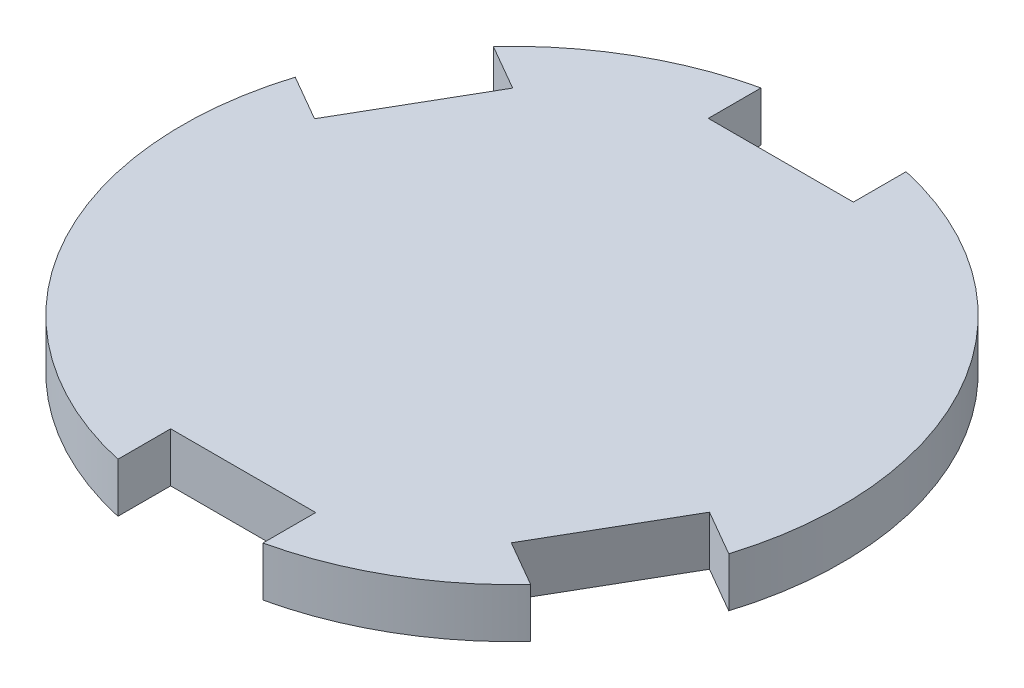
ISO-10303-21;
HEADER;
FILE_DESCRIPTION(('STEP AP214'),'2;1');
FILE_NAME('part.step','',(''),(''),'','','');
FILE_SCHEMA(('AUTOMOTIVE_DESIGN { 1 0 10303 214 1 1 1 1 }'));
ENDSEC;
DATA;
#1=APPLICATION_CONTEXT('core data for automotive mechanical design processes');
#2=APPLICATION_PROTOCOL_DEFINITION('international standard','automotive_design',2000,#1);
#3=PRODUCT_CONTEXT('',#1,'mechanical');
#4=PRODUCT('Part','Part','',(#3));
#5=PRODUCT_RELATED_PRODUCT_CATEGORY('part','',(#4));
#6=PRODUCT_DEFINITION_FORMATION('','',#4);
#7=PRODUCT_DEFINITION_CONTEXT('part definition',#1,'design');
#8=PRODUCT_DEFINITION('design','',#6,#7);
#9=PRODUCT_DEFINITION_SHAPE('','',#8);
#10=(LENGTH_UNIT() NAMED_UNIT(*) SI_UNIT(.MILLI.,.METRE.));
#11=(NAMED_UNIT(*) PLANE_ANGLE_UNIT() SI_UNIT($,.RADIAN.));
#12=(NAMED_UNIT(*) SI_UNIT($,.STERADIAN.) SOLID_ANGLE_UNIT());
#13=UNCERTAINTY_MEASURE_WITH_UNIT(LENGTH_MEASURE(1.E-05),#10,'distance_accuracy_value','');
#14=(GEOMETRIC_REPRESENTATION_CONTEXT(3) GLOBAL_UNCERTAINTY_ASSIGNED_CONTEXT((#13)) GLOBAL_UNIT_ASSIGNED_CONTEXT((#10,
#11,#12)) REPRESENTATION_CONTEXT('',''));
#15=CARTESIAN_POINT('',(0.,0.,0.));
#16=DIRECTION('',(0.,0.,1.));
#17=DIRECTION('',(1.,0.,0.));
#18=AXIS2_PLACEMENT_3D('',#15,#16,#17);
#19=CARTESIAN_POINT('',(0.,4.7625,0.));
#20=DIRECTION('',(0.,-1.,0.));
#21=DIRECTION('',(0.,0.,-1.));
#22=AXIS2_PLACEMENT_3D('',#19,#20,#21);
#23=CYLINDRICAL_SURFACE('',#22,31.75);
#24=DIRECTION('',(0.,1.,0.));
#25=VECTOR('',#24,1.);
#26=CARTESIAN_POINT('',(30.3151435358262,-0.00100000000000013,9.43687302035226));
#27=LINE('',#26,#25);
#28=CARTESIAN_POINT('',(30.3151435358262,0.,9.43687302035226));
#29=VERTEX_POINT('',#28);
#30=CARTESIAN_POINT('',(30.3151435358262,4.7625,9.43687302035226));
#31=VERTEX_POINT('',#30);
#32=EDGE_CURVE('E158',#29,#31,#27,.T.);
#33=ORIENTED_EDGE('',*,*,#32,.F.);
#34=CARTESIAN_POINT('',(0.,0.,0.));
#35=DIRECTION('',(0.,1.,0.));
#36=DIRECTION('',(0.,0.,1.));
#37=AXIS2_PLACEMENT_3D('',#34,#35,#36);
#38=CIRCLE('',#37,31.75);
#39=CARTESIAN_POINT('',(6.98500000000001,0.,-30.9721209315733));
#40=VERTEX_POINT('',#39);
#41=EDGE_CURVE('E171',#29,#40,#38,.T.);
#42=ORIENTED_EDGE('',*,*,#41,.T.);
#43=DIRECTION('',(0.,1.,0.));
#44=VECTOR('',#43,1.);
#45=CARTESIAN_POINT('',(6.98500000000001,-0.00100000000000013,-30.9721209315733));
#46=LINE('',#45,#44);
#47=CARTESIAN_POINT('',(6.98500000000001,4.7625,-30.9721209315733));
#48=VERTEX_POINT('',#47);
#49=EDGE_CURVE('E213',#40,#48,#46,.T.);
#50=ORIENTED_EDGE('',*,*,#49,.T.);
#51=CARTESIAN_POINT('',(0.,4.7625,0.));
#52=DIRECTION('',(0.,1.,0.));
#53=DIRECTION('',(0.,0.,1.));
#54=AXIS2_PLACEMENT_3D('',#51,#52,#53);
#55=CIRCLE('',#54,31.75);
#56=EDGE_CURVE('E43',#31,#48,#55,.T.);
#57=ORIENTED_EDGE('',*,*,#56,.F.);
#58=EDGE_LOOP('',(#33,#42,#50,#57));
#59=FACE_BOUND('',#58,.T.);
#60=ADVANCED_FACE('F34',(#59),#23,.T.);
#61=DIRECTION('',(0.,1.,0.));
#62=VECTOR('',#61,1.);
#63=CARTESIAN_POINT('',(-30.3151435358262,-0.00100000000000013,-9.43687302035226));
#64=LINE('',#63,#62);
#65=CARTESIAN_POINT('',(-30.3151435358262,0.,-9.43687302035226));
#66=VERTEX_POINT('',#65);
#67=CARTESIAN_POINT('',(-30.3151435358262,4.7625,-9.43687302035226));
#68=VERTEX_POINT('',#67);
#69=EDGE_CURVE('E263',#66,#68,#64,.T.);
#70=ORIENTED_EDGE('',*,*,#69,.F.);
#71=CARTESIAN_POINT('',(-6.985,0.,30.9721209315733));
#72=VERTEX_POINT('',#71);
#73=EDGE_CURVE('E172',#66,#72,#38,.T.);
#74=ORIENTED_EDGE('',*,*,#73,.T.);
#75=DIRECTION('',(0.,1.,0.));
#76=VECTOR('',#75,1.);
#77=CARTESIAN_POINT('',(-6.985,-0.00100000000000013,30.9721209315733));
#78=LINE('',#77,#76);
#79=CARTESIAN_POINT('',(-6.985,4.7625,30.9721209315733));
#80=VERTEX_POINT('',#79);
#81=EDGE_CURVE('E237',#72,#80,#78,.T.);
#82=ORIENTED_EDGE('',*,*,#81,.T.);
#83=EDGE_CURVE('E170',#68,#80,#55,.T.);
#84=ORIENTED_EDGE('',*,*,#83,.F.);
#85=EDGE_LOOP('',(#70,#74,#82,#84));
#86=FACE_BOUND('',#85,.T.);
#87=ADVANCED_FACE('F262',(#86),#23,.T.);
#88=CARTESIAN_POINT('',(0.,4.7625,0.));
#89=DIRECTION('',(0.,1.,0.));
#90=DIRECTION('',(0.,0.,1.));
#91=AXIS2_PLACEMENT_3D('',#88,#89,#90);
#92=PLANE('',#91);
#93=DIRECTION('',(0.86602540378444,0.,0.499999999999998));
#94=VECTOR('',#93,1.);
#95=CARTESIAN_POINT('',(18.9307344846013,4.7625,18.9952479112209));
#96=LINE('',#95,#94);
#97=CARTESIAN_POINT('',(18.9307344846013,4.7625,18.9952479112209));
#98=VERTEX_POINT('',#97);
#99=CARTESIAN_POINT('',(23.3301435358263,4.7625,21.5352479112209));
#100=VERTEX_POINT('',#99);
#101=EDGE_CURVE('E154',#98,#100,#96,.T.);
#102=ORIENTED_EDGE('',*,*,#101,.F.);
#103=DIRECTION('',(0.499999999999995,0.,-0.866025403784441));
#104=VECTOR('',#103,1.);
#105=CARTESIAN_POINT('',(18.9307344846013,4.7625,18.9952479112209));
#106=LINE('',#105,#104);
#107=CARTESIAN_POINT('',(25.9157344846013,4.7625,6.89687302035227));
#108=VERTEX_POINT('',#107);
#109=EDGE_CURVE('E159',#98,#108,#106,.T.);
#110=ORIENTED_EDGE('',*,*,#109,.T.);
#111=DIRECTION('',(0.86602540378444,0.,0.499999999999998));
#112=VECTOR('',#111,1.);
#113=CARTESIAN_POINT('',(25.9157344846013,4.7625,6.89687302035227));
#114=LINE('',#113,#112);
#115=EDGE_CURVE('E346',#108,#31,#114,.T.);
#116=ORIENTED_EDGE('',*,*,#115,.T.);
#117=ORIENTED_EDGE('',*,*,#56,.T.);
#118=DIRECTION('',(0.,0.,-1.));
#119=VECTOR('',#118,1.);
#120=CARTESIAN_POINT('',(6.985,4.7625,-25.8921209315733));
#121=LINE('',#120,#119);
#122=CARTESIAN_POINT('',(6.985,4.7625,-25.8921209315733));
#123=VERTEX_POINT('',#122);
#124=EDGE_CURVE('E210',#123,#48,#121,.T.);
#125=ORIENTED_EDGE('',*,*,#124,.F.);
#126=DIRECTION('',(1.,0.,0.));
#127=VECTOR('',#126,1.);
#128=CARTESIAN_POINT('',(-6.98500000000001,4.7625,-25.8921209315733));
#129=LINE('',#128,#127);
#130=CARTESIAN_POINT('',(-6.98500000000001,4.7625,-25.8921209315733));
#131=VERTEX_POINT('',#130);
#132=EDGE_CURVE('E207',#131,#123,#129,.T.);
#133=ORIENTED_EDGE('',*,*,#132,.F.);
#134=DIRECTION('',(0.,0.,1.));
#135=VECTOR('',#134,1.);
#136=CARTESIAN_POINT('',(-6.98500000000001,4.7625,-30.9721209315733));
#137=LINE('',#136,#135);
#138=CARTESIAN_POINT('',(-6.98500000000001,4.7625,-30.9721209315733));
#139=VERTEX_POINT('',#138);
#140=EDGE_CURVE('E204',#139,#131,#137,.T.);
#141=ORIENTED_EDGE('',*,*,#140,.F.);
#142=CARTESIAN_POINT('',(-23.3301435358263,4.7625,-21.5352479112209));
#143=VERTEX_POINT('',#142);
#144=EDGE_CURVE('E44',#139,#143,#55,.T.);
#145=ORIENTED_EDGE('',*,*,#144,.T.);
#146=DIRECTION('',(-0.86602540378444,0.,-0.499999999999997));
#147=VECTOR('',#146,1.);
#148=CARTESIAN_POINT('',(-18.9307344846013,4.7625,-18.9952479112209));
#149=LINE('',#148,#147);
#150=CARTESIAN_POINT('',(-18.9307344846013,4.7625,-18.9952479112209));
#151=VERTEX_POINT('',#150);
#152=EDGE_CURVE('E283',#151,#143,#149,.T.);
#153=ORIENTED_EDGE('',*,*,#152,.F.);
#154=DIRECTION('',(0.499999999999998,0.,-0.86602540378444));
#155=VECTOR('',#154,1.);
#156=CARTESIAN_POINT('',(-25.9157344846013,4.7625,-6.89687302035227));
#157=LINE('',#156,#155);
#158=CARTESIAN_POINT('',(-25.9157344846013,4.7625,-6.89687302035227));
#159=VERTEX_POINT('',#158);
#160=EDGE_CURVE('E272',#159,#151,#157,.T.);
#161=ORIENTED_EDGE('',*,*,#160,.F.);
#162=DIRECTION('',(-0.86602540378444,0.,-0.499999999999998));
#163=VECTOR('',#162,1.);
#164=CARTESIAN_POINT('',(-25.9157344846013,4.7625,-6.89687302035227));
#165=LINE('',#164,#163);
#166=EDGE_CURVE('E194',#159,#68,#165,.T.);
#167=ORIENTED_EDGE('',*,*,#166,.T.);
#168=ORIENTED_EDGE('',*,*,#83,.T.);
#169=DIRECTION('',(0.,0.,1.));
#170=VECTOR('',#169,1.);
#171=CARTESIAN_POINT('',(-6.985,4.7625,30.9721209315733));
#172=LINE('',#171,#170);
#173=CARTESIAN_POINT('',(-6.985,4.7625,25.8921209315733));
#174=VERTEX_POINT('',#173);
#175=EDGE_CURVE('E234',#174,#80,#172,.T.);
#176=ORIENTED_EDGE('',*,*,#175,.F.);
#177=DIRECTION('',(-1.,0.,0.));
#178=VECTOR('',#177,1.);
#179=CARTESIAN_POINT('',(-6.985,4.7625,25.8921209315733));
#180=LINE('',#179,#178);
#181=CARTESIAN_POINT('',(6.985,4.7625,25.8921209315733));
#182=VERTEX_POINT('',#181);
#183=EDGE_CURVE('E231',#182,#174,#180,.T.);
#184=ORIENTED_EDGE('',*,*,#183,.F.);
#185=DIRECTION('',(0.,0.,-1.));
#186=VECTOR('',#185,1.);
#187=CARTESIAN_POINT('',(6.985,4.7625,25.8921209315733));
#188=LINE('',#187,#186);
#189=CARTESIAN_POINT('',(6.98500000000001,4.7625,30.9721209315733));
#190=VERTEX_POINT('',#189);
#191=EDGE_CURVE('E228',#190,#182,#188,.T.);
#192=ORIENTED_EDGE('',*,*,#191,.F.);
#193=EDGE_CURVE('E11',#190,#100,#55,.T.);
#194=ORIENTED_EDGE('',*,*,#193,.T.);
#195=EDGE_LOOP('',(#102,#110,#116,#117,#125,#133,#141,#145,#153,#161,#167,#168,#176,#184,#192,#194));
#196=FACE_BOUND('',#195,.T.);
#197=ADVANCED_FACE('F285',(#196),#92,.T.);
#198=CARTESIAN_POINT('',(0.,0.,0.));
#199=DIRECTION('',(0.,1.,0.));
#200=DIRECTION('',(0.,0.,1.));
#201=AXIS2_PLACEMENT_3D('',#198,#199,#200);
#202=PLANE('',#201);
#203=DIRECTION('',(-0.499999999999995,0.,0.866025403784441));
#204=VECTOR('',#203,1.);
#205=CARTESIAN_POINT('',(18.9307344846013,0.,18.9952479112209));
#206=LINE('',#205,#204);
#207=CARTESIAN_POINT('',(25.9157344846013,0.,6.89687302035227));
#208=VERTEX_POINT('',#207);
#209=CARTESIAN_POINT('',(18.9307344846013,0.,18.9952479112209));
#210=VERTEX_POINT('',#209);
#211=EDGE_CURVE('E51',#208,#210,#206,.T.);
#212=ORIENTED_EDGE('',*,*,#211,.T.);
#213=DIRECTION('',(-0.86602540378444,0.,-0.499999999999998));
#214=VECTOR('',#213,1.);
#215=CARTESIAN_POINT('',(18.9307344846013,0.,18.9952479112209));
#216=LINE('',#215,#214);
#217=CARTESIAN_POINT('',(23.3301435358263,0.,21.5352479112209));
#218=VERTEX_POINT('',#217);
#219=EDGE_CURVE('E152',#218,#210,#216,.T.);
#220=ORIENTED_EDGE('',*,*,#219,.F.);
#221=CARTESIAN_POINT('',(6.98500000000001,0.,30.9721209315733));
#222=VERTEX_POINT('',#221);
#223=EDGE_CURVE('E38',#222,#218,#38,.T.);
#224=ORIENTED_EDGE('',*,*,#223,.F.);
#225=DIRECTION('',(0.,0.,1.));
#226=VECTOR('',#225,1.);
#227=CARTESIAN_POINT('',(6.985,0.,25.8921209315733));
#228=LINE('',#227,#226);
#229=CARTESIAN_POINT('',(6.985,0.,25.8921209315733));
#230=VERTEX_POINT('',#229);
#231=EDGE_CURVE('E201',#230,#222,#228,.T.);
#232=ORIENTED_EDGE('',*,*,#231,.F.);
#233=DIRECTION('',(1.,0.,0.));
#234=VECTOR('',#233,1.);
#235=CARTESIAN_POINT('',(-6.985,0.,25.8921209315733));
#236=LINE('',#235,#234);
#237=CARTESIAN_POINT('',(-6.985,0.,25.8921209315733));
#238=VERTEX_POINT('',#237);
#239=EDGE_CURVE('E222',#238,#230,#236,.T.);
#240=ORIENTED_EDGE('',*,*,#239,.F.);
#241=DIRECTION('',(0.,0.,-1.));
#242=VECTOR('',#241,1.);
#243=CARTESIAN_POINT('',(-6.985,0.,30.9721209315733));
#244=LINE('',#243,#242);
#245=EDGE_CURVE('E224',#72,#238,#244,.T.);
#246=ORIENTED_EDGE('',*,*,#245,.F.);
#247=ORIENTED_EDGE('',*,*,#73,.F.);
#248=DIRECTION('',(0.86602540378444,0.,0.499999999999998));
#249=VECTOR('',#248,1.);
#250=CARTESIAN_POINT('',(-25.9157344846013,0.,-6.89687302035227));
#251=LINE('',#250,#249);
#252=CARTESIAN_POINT('',(-25.9157344846013,0.,-6.89687302035227));
#253=VERTEX_POINT('',#252);
#254=EDGE_CURVE('E191',#66,#253,#251,.T.);
#255=ORIENTED_EDGE('',*,*,#254,.T.);
#256=DIRECTION('',(-0.499999999999998,0.,0.86602540378444));
#257=VECTOR('',#256,1.);
#258=CARTESIAN_POINT('',(-25.9157344846013,0.,-6.89687302035227));
#259=LINE('',#258,#257);
#260=CARTESIAN_POINT('',(-18.9307344846013,0.,-18.9952479112209));
#261=VERTEX_POINT('',#260);
#262=EDGE_CURVE('E189',#261,#253,#259,.T.);
#263=ORIENTED_EDGE('',*,*,#262,.F.);
#264=DIRECTION('',(0.86602540378444,0.,0.499999999999997));
#265=VECTOR('',#264,1.);
#266=CARTESIAN_POINT('',(-18.9307344846013,0.,-18.9952479112209));
#267=LINE('',#266,#265);
#268=CARTESIAN_POINT('',(-23.3301435358263,0.,-21.5352479112209));
#269=VERTEX_POINT('',#268);
#270=EDGE_CURVE('E59',#269,#261,#267,.T.);
#271=ORIENTED_EDGE('',*,*,#270,.F.);
#272=CARTESIAN_POINT('',(-6.98500000000001,0.,-30.9721209315733));
#273=VERTEX_POINT('',#272);
#274=EDGE_CURVE('E173',#273,#269,#38,.T.);
#275=ORIENTED_EDGE('',*,*,#274,.F.);
#276=DIRECTION('',(0.,0.,-1.));
#277=VECTOR('',#276,1.);
#278=CARTESIAN_POINT('',(-6.98500000000001,0.,-30.9721209315733));
#279=LINE('',#278,#277);
#280=CARTESIAN_POINT('',(-6.98500000000001,0.,-25.8921209315733));
#281=VERTEX_POINT('',#280);
#282=EDGE_CURVE('E174',#281,#273,#279,.T.);
#283=ORIENTED_EDGE('',*,*,#282,.F.);
#284=DIRECTION('',(-1.,0.,0.));
#285=VECTOR('',#284,1.);
#286=CARTESIAN_POINT('',(-6.98500000000001,0.,-25.8921209315733));
#287=LINE('',#286,#285);
#288=CARTESIAN_POINT('',(6.985,0.,-25.8921209315733));
#289=VERTEX_POINT('',#288);
#290=EDGE_CURVE('E198',#289,#281,#287,.T.);
#291=ORIENTED_EDGE('',*,*,#290,.F.);
#292=DIRECTION('',(0.,0.,1.));
#293=VECTOR('',#292,1.);
#294=CARTESIAN_POINT('',(6.985,0.,-25.8921209315733));
#295=LINE('',#294,#293);
#296=EDGE_CURVE('E200',#40,#289,#295,.T.);
#297=ORIENTED_EDGE('',*,*,#296,.F.);
#298=ORIENTED_EDGE('',*,*,#41,.F.);
#299=DIRECTION('',(-0.86602540378444,0.,-0.499999999999998));
#300=VECTOR('',#299,1.);
#301=CARTESIAN_POINT('',(25.9157344846013,0.,6.89687302035227));
#302=LINE('',#301,#300);
#303=EDGE_CURVE('E190',#29,#208,#302,.T.);
#304=ORIENTED_EDGE('',*,*,#303,.T.);
#305=EDGE_LOOP('',(#212,#220,#224,#232,#240,#246,#247,#255,#263,#271,#275,#283,#291,#297,#298,#304));
#306=FACE_BOUND('',#305,.T.);
#307=ADVANCED_FACE('F163',(#306),#202,.F.);
#308=ORIENTED_EDGE('',*,*,#223,.T.);
#309=DIRECTION('',(0.,1.,0.));
#310=VECTOR('',#309,1.);
#311=CARTESIAN_POINT('',(23.3301435358263,-0.00100000000000013,21.5352479112209));
#312=LINE('',#311,#310);
#313=EDGE_CURVE('E149',#218,#100,#312,.T.);
#314=ORIENTED_EDGE('',*,*,#313,.T.);
#315=ORIENTED_EDGE('',*,*,#193,.F.);
#316=DIRECTION('',(0.,1.,0.));
#317=VECTOR('',#316,1.);
#318=CARTESIAN_POINT('',(6.98500000000001,-0.00100000000000013,30.9721209315733));
#319=LINE('',#318,#317);
#320=EDGE_CURVE('E169',#222,#190,#319,.T.);
#321=ORIENTED_EDGE('',*,*,#320,.F.);
#322=EDGE_LOOP('',(#308,#314,#315,#321));
#323=FACE_BOUND('',#322,.T.);
#324=ADVANCED_FACE('F168',(#323),#23,.T.);
#325=ORIENTED_EDGE('',*,*,#274,.T.);
#326=DIRECTION('',(0.,1.,0.));
#327=VECTOR('',#326,1.);
#328=CARTESIAN_POINT('',(-23.3301435358263,-0.00100000000000013,-21.5352479112209));
#329=LINE('',#328,#327);
#330=EDGE_CURVE('E181',#269,#143,#329,.T.);
#331=ORIENTED_EDGE('',*,*,#330,.T.);
#332=ORIENTED_EDGE('',*,*,#144,.F.);
#333=DIRECTION('',(0.,1.,0.));
#334=VECTOR('',#333,1.);
#335=CARTESIAN_POINT('',(-6.98500000000001,-0.00100000000000013,-30.9721209315733));
#336=LINE('',#335,#334);
#337=EDGE_CURVE('E183',#273,#139,#336,.T.);
#338=ORIENTED_EDGE('',*,*,#337,.F.);
#339=EDGE_LOOP('',(#325,#331,#332,#338));
#340=FACE_BOUND('',#339,.T.);
#341=ADVANCED_FACE('F36',(#340),#23,.T.);
#342=CARTESIAN_POINT('',(-6.985,-0.00100000000000013,30.9721209315733));
#343=DIRECTION('',(-1.,0.,0.));
#344=DIRECTION('',(0.,0.,1.));
#345=AXIS2_PLACEMENT_3D('',#342,#343,#344);
#346=PLANE('',#345);
#347=ORIENTED_EDGE('',*,*,#245,.T.);
#348=DIRECTION('',(0.,1.,0.));
#349=VECTOR('',#348,1.);
#350=CARTESIAN_POINT('',(-6.985,-0.00100000000000013,25.8921209315733));
#351=LINE('',#350,#349);
#352=EDGE_CURVE('E240',#238,#174,#351,.T.);
#353=ORIENTED_EDGE('',*,*,#352,.T.);
#354=ORIENTED_EDGE('',*,*,#175,.T.);
#355=ORIENTED_EDGE('',*,*,#81,.F.);
#356=EDGE_LOOP('',(#347,#353,#354,#355));
#357=FACE_BOUND('',#356,.T.);
#358=ADVANCED_FACE('F258',(#357),#346,.F.);
#359=CARTESIAN_POINT('',(-6.985,-0.00100000000000013,25.8921209315733));
#360=DIRECTION('',(0.,0.,-1.));
#361=DIRECTION('',(-1.,0.,0.));
#362=AXIS2_PLACEMENT_3D('',#359,#360,#361);
#363=PLANE('',#362);
#364=ORIENTED_EDGE('',*,*,#239,.T.);
#365=DIRECTION('',(0.,1.,0.));
#366=VECTOR('',#365,1.);
#367=CARTESIAN_POINT('',(6.985,-0.00100000000000013,25.8921209315733));
#368=LINE('',#367,#366);
#369=EDGE_CURVE('E242',#230,#182,#368,.T.);
#370=ORIENTED_EDGE('',*,*,#369,.T.);
#371=ORIENTED_EDGE('',*,*,#183,.T.);
#372=ORIENTED_EDGE('',*,*,#352,.F.);
#373=EDGE_LOOP('',(#364,#370,#371,#372));
#374=FACE_BOUND('',#373,.T.);
#375=ADVANCED_FACE('F253',(#374),#363,.F.);
#376=CARTESIAN_POINT('',(6.985,-0.00100000000000013,25.8921209315733));
#377=DIRECTION('',(1.,0.,0.));
#378=DIRECTION('',(0.,0.,-1.));
#379=AXIS2_PLACEMENT_3D('',#376,#377,#378);
#380=PLANE('',#379);
#381=ORIENTED_EDGE('',*,*,#231,.T.);
#382=ORIENTED_EDGE('',*,*,#320,.T.);
#383=ORIENTED_EDGE('',*,*,#191,.T.);
#384=ORIENTED_EDGE('',*,*,#369,.F.);
#385=EDGE_LOOP('',(#381,#382,#383,#384));
#386=FACE_BOUND('',#385,.T.);
#387=ADVANCED_FACE('F247',(#386),#380,.F.);
#388=CARTESIAN_POINT('',(6.985,-0.00100000000000013,-25.8921209315733));
#389=DIRECTION('',(1.,0.,0.));
#390=DIRECTION('',(0.,0.,-1.));
#391=AXIS2_PLACEMENT_3D('',#388,#389,#390);
#392=PLANE('',#391);
#393=ORIENTED_EDGE('',*,*,#296,.T.);
#394=DIRECTION('',(0.,1.,0.));
#395=VECTOR('',#394,1.);
#396=CARTESIAN_POINT('',(6.985,-0.00100000000000013,-25.8921209315733));
#397=LINE('',#396,#395);
#398=EDGE_CURVE('E216',#289,#123,#397,.T.);
#399=ORIENTED_EDGE('',*,*,#398,.T.);
#400=ORIENTED_EDGE('',*,*,#124,.T.);
#401=ORIENTED_EDGE('',*,*,#49,.F.);
#402=EDGE_LOOP('',(#393,#399,#400,#401));
#403=FACE_BOUND('',#402,.T.);
#404=ADVANCED_FACE('F320',(#403),#392,.F.);
#405=CARTESIAN_POINT('',(-6.98500000000001,-0.00100000000000013,-25.8921209315733));
#406=DIRECTION('',(0.,0.,1.));
#407=DIRECTION('',(1.,0.,0.));
#408=AXIS2_PLACEMENT_3D('',#405,#406,#407);
#409=PLANE('',#408);
#410=ORIENTED_EDGE('',*,*,#290,.T.);
#411=DIRECTION('',(0.,1.,0.));
#412=VECTOR('',#411,1.);
#413=CARTESIAN_POINT('',(-6.98500000000001,-0.00100000000000013,-25.8921209315733));
#414=LINE('',#413,#412);
#415=EDGE_CURVE('E218',#281,#131,#414,.T.);
#416=ORIENTED_EDGE('',*,*,#415,.T.);
#417=ORIENTED_EDGE('',*,*,#132,.T.);
#418=ORIENTED_EDGE('',*,*,#398,.F.);
#419=EDGE_LOOP('',(#410,#416,#417,#418));
#420=FACE_BOUND('',#419,.T.);
#421=ADVANCED_FACE('F325',(#420),#409,.F.);
#422=CARTESIAN_POINT('',(-6.98500000000001,-0.00100000000000013,-30.9721209315733));
#423=DIRECTION('',(-1.,0.,0.));
#424=DIRECTION('',(0.,0.,1.));
#425=AXIS2_PLACEMENT_3D('',#422,#423,#424);
#426=PLANE('',#425);
#427=ORIENTED_EDGE('',*,*,#282,.T.);
#428=ORIENTED_EDGE('',*,*,#337,.T.);
#429=ORIENTED_EDGE('',*,*,#140,.T.);
#430=ORIENTED_EDGE('',*,*,#415,.F.);
#431=EDGE_LOOP('',(#427,#428,#429,#430));
#432=FACE_BOUND('',#431,.T.);
#433=ADVANCED_FACE('F296',(#432),#426,.F.);
#434=CARTESIAN_POINT('',(-25.9157344846013,-0.00100000000000013,-6.89687302035227));
#435=DIRECTION('',(0.499999999999998,0.,-0.86602540378444));
#436=DIRECTION('',(-0.86602540378444,0.,-0.499999999999998));
#437=AXIS2_PLACEMENT_3D('',#434,#435,#436);
#438=PLANE('',#437);
#439=ORIENTED_EDGE('',*,*,#69,.T.);
#440=ORIENTED_EDGE('',*,*,#166,.F.);
#441=DIRECTION('',(0.,1.,0.));
#442=VECTOR('',#441,1.);
#443=CARTESIAN_POINT('',(-25.9157344846013,-0.00100000000000013,-6.89687302035227));
#444=LINE('',#443,#442);
#445=EDGE_CURVE('E268',#253,#159,#444,.T.);
#446=ORIENTED_EDGE('',*,*,#445,.F.);
#447=ORIENTED_EDGE('',*,*,#254,.F.);
#448=EDGE_LOOP('',(#439,#440,#446,#447));
#449=FACE_BOUND('',#448,.T.);
#450=ADVANCED_FACE('F265',(#449),#438,.T.);
#451=CARTESIAN_POINT('',(-18.9307344846013,-0.00100000000000013,-18.9952479112209));
#452=DIRECTION('',(0.499999999999997,0.,-0.86602540378444));
#453=DIRECTION('',(-0.86602540378444,0.,-0.499999999999997));
#454=AXIS2_PLACEMENT_3D('',#451,#452,#453);
#455=PLANE('',#454);
#456=ORIENTED_EDGE('',*,*,#270,.T.);
#457=DIRECTION('',(0.,1.,0.));
#458=VECTOR('',#457,1.);
#459=CARTESIAN_POINT('',(-18.9307344846013,-0.00100000000000013,-18.9952479112209));
#460=LINE('',#459,#458);
#461=EDGE_CURVE('E273',#261,#151,#460,.T.);
#462=ORIENTED_EDGE('',*,*,#461,.T.);
#463=ORIENTED_EDGE('',*,*,#152,.T.);
#464=ORIENTED_EDGE('',*,*,#330,.F.);
#465=EDGE_LOOP('',(#456,#462,#463,#464));
#466=FACE_BOUND('',#465,.T.);
#467=ADVANCED_FACE('F288',(#466),#455,.F.);
#468=CARTESIAN_POINT('',(-25.9157344846013,-0.00100000000000013,-6.89687302035227));
#469=DIRECTION('',(0.86602540378444,0.,0.499999999999998));
#470=DIRECTION('',(0.499999999999998,0.,-0.86602540378444));
#471=AXIS2_PLACEMENT_3D('',#468,#469,#470);
#472=PLANE('',#471);
#473=ORIENTED_EDGE('',*,*,#262,.T.);
#474=ORIENTED_EDGE('',*,*,#445,.T.);
#475=ORIENTED_EDGE('',*,*,#160,.T.);
#476=ORIENTED_EDGE('',*,*,#461,.F.);
#477=EDGE_LOOP('',(#473,#474,#475,#476));
#478=FACE_BOUND('',#477,.T.);
#479=ADVANCED_FACE('F275',(#478),#472,.F.);
#480=CARTESIAN_POINT('',(18.9307344846013,-0.00100000000000013,18.9952479112209));
#481=DIRECTION('',(-0.499999999999998,0.,0.86602540378444));
#482=DIRECTION('',(0.86602540378444,0.,0.499999999999998));
#483=AXIS2_PLACEMENT_3D('',#480,#481,#482);
#484=PLANE('',#483);
#485=ORIENTED_EDGE('',*,*,#219,.T.);
#486=DIRECTION('',(0.,1.,0.));
#487=VECTOR('',#486,1.);
#488=CARTESIAN_POINT('',(18.9307344846013,-0.00100000000000013,18.9952479112209));
#489=LINE('',#488,#487);
#490=EDGE_CURVE('E225',#210,#98,#489,.T.);
#491=ORIENTED_EDGE('',*,*,#490,.T.);
#492=ORIENTED_EDGE('',*,*,#101,.T.);
#493=ORIENTED_EDGE('',*,*,#313,.F.);
#494=EDGE_LOOP('',(#485,#491,#492,#493));
#495=FACE_BOUND('',#494,.T.);
#496=ADVANCED_FACE('F151',(#495),#484,.F.);
#497=CARTESIAN_POINT('',(18.9307344846013,-0.00100000000000013,18.9952479112209));
#498=DIRECTION('',(0.866025403784441,0.,0.499999999999995));
#499=DIRECTION('',(0.499999999999995,0.,-0.866025403784441));
#500=AXIS2_PLACEMENT_3D('',#497,#498,#499);
#501=PLANE('',#500);
#502=DIRECTION('',(0.,1.,0.));
#503=VECTOR('',#502,1.);
#504=CARTESIAN_POINT('',(25.9157344846013,-0.00100000000000013,6.89687302035227));
#505=LINE('',#504,#503);
#506=EDGE_CURVE('E345',#208,#108,#505,.T.);
#507=ORIENTED_EDGE('',*,*,#506,.T.);
#508=ORIENTED_EDGE('',*,*,#109,.F.);
#509=ORIENTED_EDGE('',*,*,#490,.F.);
#510=ORIENTED_EDGE('',*,*,#211,.F.);
#511=EDGE_LOOP('',(#507,#508,#509,#510));
#512=FACE_BOUND('',#511,.T.);
#513=ADVANCED_FACE('F355',(#512),#501,.T.);
#514=CARTESIAN_POINT('',(25.9157344846013,-0.00100000000000013,6.89687302035227));
#515=DIRECTION('',(-0.499999999999998,0.,0.86602540378444));
#516=DIRECTION('',(0.86602540378444,0.,0.499999999999998));
#517=AXIS2_PLACEMENT_3D('',#514,#515,#516);
#518=PLANE('',#517);
#519=ORIENTED_EDGE('',*,*,#32,.T.);
#520=ORIENTED_EDGE('',*,*,#115,.F.);
#521=ORIENTED_EDGE('',*,*,#506,.F.);
#522=ORIENTED_EDGE('',*,*,#303,.F.);
#523=EDGE_LOOP('',(#519,#520,#521,#522));
#524=FACE_BOUND('',#523,.T.);
#525=ADVANCED_FACE('F343',(#524),#518,.T.);
#526=CLOSED_SHELL('',(#60,#87,#197,#307,#324,#341,#358,#375,#387,#404,#421,#433,#450,#467,#479,
#496,#513,#525));
#527=MANIFOLD_SOLID_BREP('B2',#526);
#528=ADVANCED_BREP_SHAPE_REPRESENTATION('',(#18,#527),#14);
#529=SHAPE_DEFINITION_REPRESENTATION(#9,#528);
ENDSEC;
END-ISO-10303-21;
